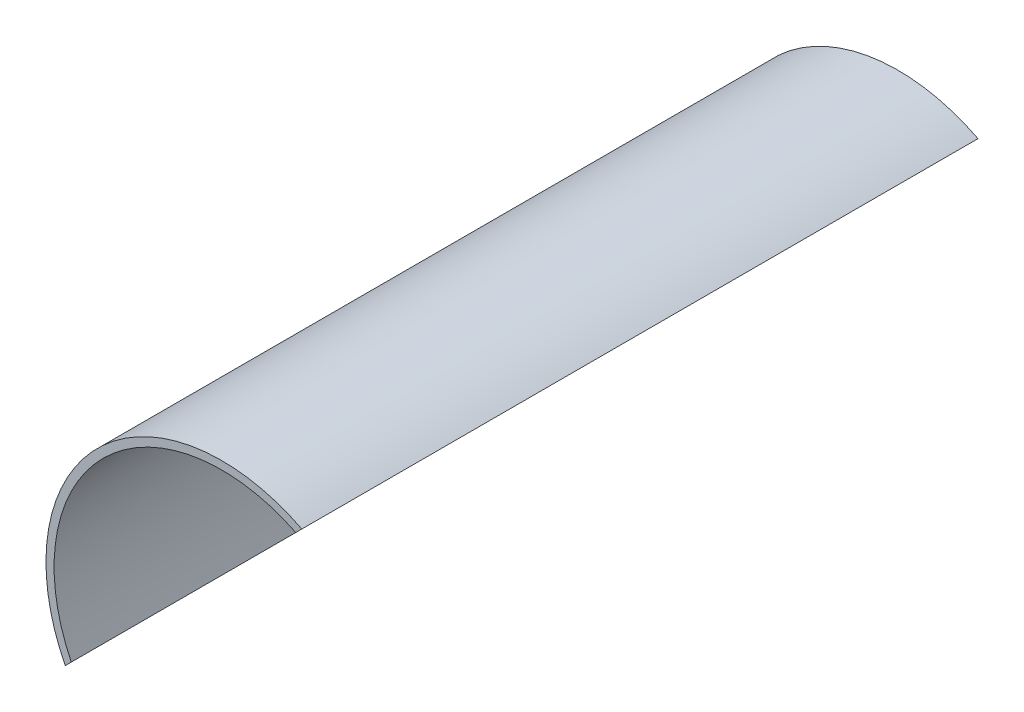
ISO-10303-21;
HEADER;
FILE_DESCRIPTION(('STEP AP214'),'2;1');
FILE_NAME('part.step','',(''),(''),'','','');
FILE_SCHEMA(('AUTOMOTIVE_DESIGN { 1 0 10303 214 1 1 1 1 }'));
ENDSEC;
DATA;
#1=APPLICATION_CONTEXT('core data for automotive mechanical design processes');
#2=APPLICATION_PROTOCOL_DEFINITION('international standard','automotive_design',2000,#1);
#3=PRODUCT_CONTEXT('',#1,'mechanical');
#4=PRODUCT('Part','Part','',(#3));
#5=PRODUCT_RELATED_PRODUCT_CATEGORY('part','',(#4));
#6=PRODUCT_DEFINITION_FORMATION('','',#4);
#7=PRODUCT_DEFINITION_CONTEXT('part definition',#1,'design');
#8=PRODUCT_DEFINITION('design','',#6,#7);
#9=PRODUCT_DEFINITION_SHAPE('','',#8);
#10=(LENGTH_UNIT() NAMED_UNIT(*) SI_UNIT(.MILLI.,.METRE.));
#11=(NAMED_UNIT(*) PLANE_ANGLE_UNIT() SI_UNIT($,.RADIAN.));
#12=(NAMED_UNIT(*) SI_UNIT($,.STERADIAN.) SOLID_ANGLE_UNIT());
#13=UNCERTAINTY_MEASURE_WITH_UNIT(LENGTH_MEASURE(1.E-05),#10,'distance_accuracy_value','');
#14=(GEOMETRIC_REPRESENTATION_CONTEXT(3) GLOBAL_UNCERTAINTY_ASSIGNED_CONTEXT((#13)) GLOBAL_UNIT_ASSIGNED_CONTEXT((#10,
#11,#12)) REPRESENTATION_CONTEXT('',''));
#15=CARTESIAN_POINT('',(0.,0.,0.));
#16=DIRECTION('',(0.,0.,1.));
#17=DIRECTION('',(1.,0.,0.));
#18=AXIS2_PLACEMENT_3D('',#15,#16,#17);
#19=CARTESIAN_POINT('',(0.,0.,250.));
#20=DIRECTION('',(0.,0.,1.));
#21=DIRECTION('',(1.,0.,0.));
#22=AXIS2_PLACEMENT_3D('',#19,#20,#21);
#23=PLANE('',#22);
#24=DIRECTION('',(0.707106781186548,0.707106781186547,0.));
#25=VECTOR('',#24,1.);
#26=CARTESIAN_POINT('',(-60.1040764008565,-31.8198051533946,250.));
#27=LINE('',#26,#25);
#28=CARTESIAN_POINT('',(27.3548522187619,55.6391234662238,250.));
#29=VERTEX_POINT('',#28);
#30=CARTESIAN_POINT('',(29.5900035876088,57.8742748350707,250.));
#31=VERTEX_POINT('',#30);
#32=EDGE_CURVE('E60',#29,#31,#27,.T.);
#33=ORIENTED_EDGE('',*,*,#32,.T.);
#34=CARTESIAN_POINT('',(0.,0.,250.));
#35=DIRECTION('',(0.,0.,1.));
#36=DIRECTION('',(1.,0.,0.));
#37=AXIS2_PLACEMENT_3D('',#34,#35,#36);
#38=CIRCLE('',#37,65.);
#39=CARTESIAN_POINT('',(-57.8742748350707,-29.5900035876088,250.));
#40=VERTEX_POINT('',#39);
#41=EDGE_CURVE('E89',#31,#40,#38,.T.);
#42=ORIENTED_EDGE('',*,*,#41,.T.);
#43=CARTESIAN_POINT('',(-55.6391234662238,-27.3548522187619,250.));
#44=VERTEX_POINT('',#43);
#45=EDGE_CURVE('E76',#40,#44,#27,.T.);
#46=ORIENTED_EDGE('',*,*,#45,.T.);
#47=CARTESIAN_POINT('',(0.,0.,250.));
#48=DIRECTION('',(0.,0.,1.));
#49=DIRECTION('',(1.,0.,0.));
#50=AXIS2_PLACEMENT_3D('',#47,#48,#49);
#51=CIRCLE('',#50,62.);
#52=EDGE_CURVE('E96',#29,#44,#51,.T.);
#53=ORIENTED_EDGE('',*,*,#52,.F.);
#54=EDGE_LOOP('',(#33,#42,#46,#53));
#55=FACE_BOUND('',#54,.T.);
#56=ADVANCED_FACE('F38',(#55),#23,.T.);
#57=CARTESIAN_POINT('',(0.,0.,0.));
#58=DIRECTION('',(0.,0.,1.));
#59=DIRECTION('',(1.,0.,0.));
#60=AXIS2_PLACEMENT_3D('',#57,#58,#59);
#61=PLANE('',#60);
#62=CARTESIAN_POINT('',(0.,0.,0.));
#63=DIRECTION('',(0.,0.,1.));
#64=DIRECTION('',(1.,0.,0.));
#65=AXIS2_PLACEMENT_3D('',#62,#63,#64);
#66=CIRCLE('',#65,65.);
#67=CARTESIAN_POINT('',(29.5900035876088,57.8742748350707,0.));
#68=VERTEX_POINT('',#67);
#69=CARTESIAN_POINT('',(-57.8742748350707,-29.5900035876088,0.));
#70=VERTEX_POINT('',#69);
#71=EDGE_CURVE('E91',#68,#70,#66,.T.);
#72=ORIENTED_EDGE('',*,*,#71,.F.);
#73=DIRECTION('',(-0.707106781186548,-0.707106781186547,0.));
#74=VECTOR('',#73,1.);
#75=CARTESIAN_POINT('',(-60.1040764008565,-31.8198051533946,0.));
#76=LINE('',#75,#74);
#77=CARTESIAN_POINT('',(27.3548522187619,55.6391234662238,0.));
#78=VERTEX_POINT('',#77);
#79=EDGE_CURVE('E93',#68,#78,#76,.T.);
#80=ORIENTED_EDGE('',*,*,#79,.T.);
#81=CARTESIAN_POINT('',(0.,0.,0.));
#82=DIRECTION('',(0.,0.,1.));
#83=DIRECTION('',(1.,0.,0.));
#84=AXIS2_PLACEMENT_3D('',#81,#82,#83);
#85=CIRCLE('',#84,62.);
#86=CARTESIAN_POINT('',(-55.6391234662238,-27.3548522187619,0.));
#87=VERTEX_POINT('',#86);
#88=EDGE_CURVE('E99',#78,#87,#85,.T.);
#89=ORIENTED_EDGE('',*,*,#88,.T.);
#90=EDGE_CURVE('E53',#87,#70,#76,.T.);
#91=ORIENTED_EDGE('',*,*,#90,.T.);
#92=EDGE_LOOP('',(#72,#80,#89,#91));
#93=FACE_BOUND('',#92,.T.);
#94=ADVANCED_FACE('F107',(#93),#61,.F.);
#95=CARTESIAN_POINT('',(0.,0.,250.));
#96=DIRECTION('',(0.,0.,-1.));
#97=DIRECTION('',(-1.,0.,0.));
#98=AXIS2_PLACEMENT_3D('',#95,#96,#97);
#99=CYLINDRICAL_SURFACE('',#98,65.);
#100=ORIENTED_EDGE('',*,*,#41,.F.);
#101=DIRECTION('',(0.,0.,-1.));
#102=VECTOR('',#101,1.);
#103=CARTESIAN_POINT('',(29.5900035876088,57.8742748350707,250.));
#104=LINE('',#103,#102);
#105=EDGE_CURVE('E92',#31,#68,#104,.T.);
#106=ORIENTED_EDGE('',*,*,#105,.T.);
#107=ORIENTED_EDGE('',*,*,#71,.T.);
#108=DIRECTION('',(0.,0.,-1.));
#109=VECTOR('',#108,1.);
#110=CARTESIAN_POINT('',(-57.8742748350707,-29.5900035876088,250.));
#111=LINE('',#110,#109);
#112=EDGE_CURVE('E79',#70,#40,#111,.F.);
#113=ORIENTED_EDGE('',*,*,#112,.T.);
#114=EDGE_LOOP('',(#100,#106,#107,#113));
#115=FACE_BOUND('',#114,.T.);
#116=ADVANCED_FACE('F40',(#115),#99,.T.);
#117=CARTESIAN_POINT('',(0.,0.,250.));
#118=DIRECTION('',(0.,0.,-1.));
#119=DIRECTION('',(-1.,0.,0.));
#120=AXIS2_PLACEMENT_3D('',#117,#118,#119);
#121=CYLINDRICAL_SURFACE('',#120,62.);
#122=DIRECTION('',(0.,0.,-1.));
#123=VECTOR('',#122,1.);
#124=CARTESIAN_POINT('',(27.3548522187619,55.6391234662238,250.));
#125=LINE('',#124,#123);
#126=EDGE_CURVE('E11',#29,#78,#125,.T.);
#127=ORIENTED_EDGE('',*,*,#126,.F.);
#128=ORIENTED_EDGE('',*,*,#52,.T.);
#129=DIRECTION('',(0.,0.,-1.));
#130=VECTOR('',#129,1.);
#131=CARTESIAN_POINT('',(-55.6391234662238,-27.3548522187619,250.));
#132=LINE('',#131,#130);
#133=EDGE_CURVE('E46',#87,#44,#132,.F.);
#134=ORIENTED_EDGE('',*,*,#133,.F.);
#135=ORIENTED_EDGE('',*,*,#88,.F.);
#136=EDGE_LOOP('',(#127,#128,#134,#135));
#137=FACE_BOUND('',#136,.T.);
#138=ADVANCED_FACE('F109',(#137),#121,.F.);
#139=CARTESIAN_POINT('',(-14.142135623731,14.142135623731,0.));
#140=DIRECTION('',(-0.707106781186547,0.707106781186548,0.));
#141=DIRECTION('',(-0.707106781186548,-0.707106781186547,0.));
#142=AXIS2_PLACEMENT_3D('',#139,#140,#141);
#143=PLANE('',#142);
#144=ORIENTED_EDGE('',*,*,#90,.F.);
#145=ORIENTED_EDGE('',*,*,#133,.T.);
#146=ORIENTED_EDGE('',*,*,#45,.F.);
#147=ORIENTED_EDGE('',*,*,#112,.F.);
#148=EDGE_LOOP('',(#144,#145,#146,#147));
#149=FACE_BOUND('',#148,.T.);
#150=ADVANCED_FACE('F78',(#149),#143,.F.);
#151=ORIENTED_EDGE('',*,*,#32,.F.);
#152=ORIENTED_EDGE('',*,*,#126,.T.);
#153=ORIENTED_EDGE('',*,*,#79,.F.);
#154=ORIENTED_EDGE('',*,*,#105,.F.);
#155=EDGE_LOOP('',(#151,#152,#153,#154));
#156=FACE_BOUND('',#155,.T.);
#157=ADVANCED_FACE('F110',(#156),#143,.F.);
#158=CLOSED_SHELL('',(#56,#94,#116,#138,#150,#157));
#159=MANIFOLD_SOLID_BREP('B2',#158);
#160=ADVANCED_BREP_SHAPE_REPRESENTATION('',(#18,#159),#14);
#161=SHAPE_DEFINITION_REPRESENTATION(#9,#160);
ENDSEC;
END-ISO-10303-21;
